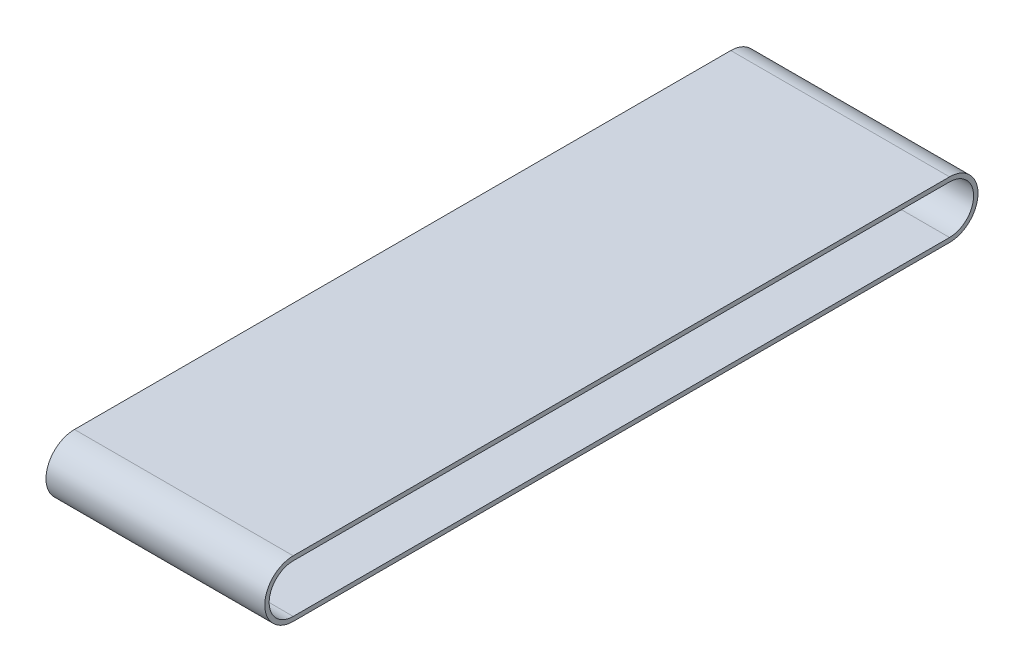
ISO-10303-21;
HEADER;
FILE_DESCRIPTION(('STEP AP214'),'2;1');
FILE_NAME('part.step','',(''),(''),'','','');
FILE_SCHEMA(('AUTOMOTIVE_DESIGN { 1 0 10303 214 1 1 1 1 }'));
ENDSEC;
DATA;
#1=APPLICATION_CONTEXT('core data for automotive mechanical design processes');
#2=APPLICATION_PROTOCOL_DEFINITION('international standard','automotive_design',2000,#1);
#3=PRODUCT_CONTEXT('',#1,'mechanical');
#4=PRODUCT('Part','Part','',(#3));
#5=PRODUCT_RELATED_PRODUCT_CATEGORY('part','',(#4));
#6=PRODUCT_DEFINITION_FORMATION('','',#4);
#7=PRODUCT_DEFINITION_CONTEXT('part definition',#1,'design');
#8=PRODUCT_DEFINITION('design','',#6,#7);
#9=PRODUCT_DEFINITION_SHAPE('','',#8);
#10=(LENGTH_UNIT() NAMED_UNIT(*) SI_UNIT(.MILLI.,.METRE.));
#11=(NAMED_UNIT(*) PLANE_ANGLE_UNIT() SI_UNIT($,.RADIAN.));
#12=(NAMED_UNIT(*) SI_UNIT($,.STERADIAN.) SOLID_ANGLE_UNIT());
#13=UNCERTAINTY_MEASURE_WITH_UNIT(LENGTH_MEASURE(1.E-05),#10,'distance_accuracy_value','');
#14=(GEOMETRIC_REPRESENTATION_CONTEXT(3) GLOBAL_UNCERTAINTY_ASSIGNED_CONTEXT((#13)) GLOBAL_UNIT_ASSIGNED_CONTEXT((#10,
#11,#12)) REPRESENTATION_CONTEXT('',''));
#15=CARTESIAN_POINT('',(0.,0.,0.));
#16=DIRECTION('',(0.,0.,1.));
#17=DIRECTION('',(1.,0.,0.));
#18=AXIS2_PLACEMENT_3D('',#15,#16,#17);
#19=CARTESIAN_POINT('',(100.,22.8481012658228,183.678713125152));
#20=DIRECTION('',(1.,0.,0.));
#21=DIRECTION('',(0.,0.,-1.));
#22=AXIS2_PLACEMENT_3D('',#19,#20,#21);
#23=PLANE('',#22);
#24=CARTESIAN_POINT('',(100.,22.8481012658228,183.678713125152));
#25=DIRECTION('',(1.,0.,0.));
#26=DIRECTION('',(0.,0.,-1.));
#27=AXIS2_PLACEMENT_3D('',#24,#25,#26);
#28=CIRCLE('',#27,13.);
#29=CARTESIAN_POINT('',(100.,35.8481012658228,183.678713125152));
#30=VERTEX_POINT('',#29);
#31=CARTESIAN_POINT('',(100.,9.84810126582282,183.678713125152));
#32=VERTEX_POINT('',#31);
#33=EDGE_CURVE('E134',#30,#32,#28,.T.);
#34=ORIENTED_EDGE('',*,*,#33,.T.);
#35=DIRECTION('',(0.,0.,-1.));
#36=VECTOR('',#35,1.);
#37=CARTESIAN_POINT('',(100.,9.84810126582282,183.678713125152));
#38=LINE('',#37,#36);
#39=CARTESIAN_POINT('',(100.,9.84810126582286,-116.321286874848));
#40=VERTEX_POINT('',#39);
#41=EDGE_CURVE('E137',#32,#40,#38,.T.);
#42=ORIENTED_EDGE('',*,*,#41,.T.);
#43=CARTESIAN_POINT('',(100.,22.8481012658229,-116.321286874848));
#44=DIRECTION('',(1.,0.,0.));
#45=DIRECTION('',(0.,0.,1.));
#46=AXIS2_PLACEMENT_3D('',#43,#44,#45);
#47=CIRCLE('',#46,13.);
#48=CARTESIAN_POINT('',(100.,35.8481012658228,-116.321286874848));
#49=VERTEX_POINT('',#48);
#50=EDGE_CURVE('E140',#40,#49,#47,.T.);
#51=ORIENTED_EDGE('',*,*,#50,.T.);
#52=DIRECTION('',(0.,0.,1.));
#53=VECTOR('',#52,1.);
#54=CARTESIAN_POINT('',(100.,35.8481012658228,183.678713125152));
#55=LINE('',#54,#53);
#56=EDGE_CURVE('E142',#49,#30,#55,.T.);
#57=ORIENTED_EDGE('',*,*,#56,.T.);
#58=EDGE_LOOP('',(#34,#42,#51,#57));
#59=FACE_BOUND('',#58,.T.);
#60=DIRECTION('',(0.,0.,-1.));
#61=VECTOR('',#60,1.);
#62=CARTESIAN_POINT('',(100.,11.8481012658228,183.678713125152));
#63=LINE('',#62,#61);
#64=CARTESIAN_POINT('',(100.,11.8481012658228,183.678713125152));
#65=VERTEX_POINT('',#64);
#66=CARTESIAN_POINT('',(100.,11.8481012658228,-116.321286874848));
#67=VERTEX_POINT('',#66);
#68=EDGE_CURVE('E106',#65,#67,#63,.T.);
#69=ORIENTED_EDGE('',*,*,#68,.F.);
#70=CARTESIAN_POINT('',(100.,22.8481012658228,183.678713125152));
#71=DIRECTION('',(1.,0.,0.));
#72=DIRECTION('',(0.,0.,-1.));
#73=AXIS2_PLACEMENT_3D('',#70,#71,#72);
#74=CIRCLE('',#73,11.);
#75=CARTESIAN_POINT('',(100.,33.8481012658228,183.678713125152));
#76=VERTEX_POINT('',#75);
#77=EDGE_CURVE('E98',#76,#65,#74,.T.);
#78=ORIENTED_EDGE('',*,*,#77,.F.);
#79=DIRECTION('',(0.,0.,1.));
#80=VECTOR('',#79,1.);
#81=CARTESIAN_POINT('',(100.,33.8481012658228,183.678713125152));
#82=LINE('',#81,#80);
#83=CARTESIAN_POINT('',(100.,33.8481012658229,-116.321286874848));
#84=VERTEX_POINT('',#83);
#85=EDGE_CURVE('E120',#84,#76,#82,.T.);
#86=ORIENTED_EDGE('',*,*,#85,.F.);
#87=CARTESIAN_POINT('',(100.,22.8481012658229,-116.321286874848));
#88=DIRECTION('',(1.,0.,0.));
#89=DIRECTION('',(0.,0.,1.));
#90=AXIS2_PLACEMENT_3D('',#87,#88,#89);
#91=CIRCLE('',#90,11.);
#92=EDGE_CURVE('E118',#67,#84,#91,.T.);
#93=ORIENTED_EDGE('',*,*,#92,.F.);
#94=EDGE_LOOP('',(#69,#78,#86,#93));
#95=FACE_BOUND('',#94,.T.);
#96=ADVANCED_FACE('F33',(#59,#95),#23,.T.);
#97=CARTESIAN_POINT('',(0.,22.8481012658228,183.678713125152));
#98=DIRECTION('',(1.,0.,0.));
#99=DIRECTION('',(0.,0.,-1.));
#100=AXIS2_PLACEMENT_3D('',#97,#98,#99);
#101=PLANE('',#100);
#102=CARTESIAN_POINT('',(0.,22.8481012658228,183.678713125152));
#103=DIRECTION('',(1.,0.,0.));
#104=DIRECTION('',(0.,0.,-1.));
#105=AXIS2_PLACEMENT_3D('',#102,#103,#104);
#106=CIRCLE('',#105,13.);
#107=CARTESIAN_POINT('',(0.,35.8481012658228,183.678713125152));
#108=VERTEX_POINT('',#107);
#109=CARTESIAN_POINT('',(0.,9.84810126582282,183.678713125152));
#110=VERTEX_POINT('',#109);
#111=EDGE_CURVE('E114',#108,#110,#106,.T.);
#112=ORIENTED_EDGE('',*,*,#111,.F.);
#113=DIRECTION('',(0.,0.,1.));
#114=VECTOR('',#113,1.);
#115=CARTESIAN_POINT('',(0.,35.8481012658228,183.678713125152));
#116=LINE('',#115,#114);
#117=CARTESIAN_POINT('',(0.,35.8481012658228,-116.321286874848));
#118=VERTEX_POINT('',#117);
#119=EDGE_CURVE('E138',#118,#108,#116,.T.);
#120=ORIENTED_EDGE('',*,*,#119,.F.);
#121=CARTESIAN_POINT('',(0.,22.8481012658229,-116.321286874848));
#122=DIRECTION('',(1.,0.,0.));
#123=DIRECTION('',(0.,0.,1.));
#124=AXIS2_PLACEMENT_3D('',#121,#122,#123);
#125=CIRCLE('',#124,13.);
#126=CARTESIAN_POINT('',(0.,9.84810126582286,-116.321286874848));
#127=VERTEX_POINT('',#126);
#128=EDGE_CURVE('E149',#127,#118,#125,.T.);
#129=ORIENTED_EDGE('',*,*,#128,.F.);
#130=DIRECTION('',(0.,0.,-1.));
#131=VECTOR('',#130,1.);
#132=CARTESIAN_POINT('',(0.,9.84810126582282,183.678713125152));
#133=LINE('',#132,#131);
#134=EDGE_CURVE('E147',#110,#127,#133,.T.);
#135=ORIENTED_EDGE('',*,*,#134,.F.);
#136=EDGE_LOOP('',(#112,#120,#129,#135));
#137=FACE_BOUND('',#136,.T.);
#138=CARTESIAN_POINT('',(0.,22.8481012658228,183.678713125152));
#139=DIRECTION('',(1.,0.,0.));
#140=DIRECTION('',(0.,0.,-1.));
#141=AXIS2_PLACEMENT_3D('',#138,#139,#140);
#142=CIRCLE('',#141,11.);
#143=CARTESIAN_POINT('',(0.,33.8481012658228,183.678713125152));
#144=VERTEX_POINT('',#143);
#145=CARTESIAN_POINT('',(0.,11.8481012658228,183.678713125152));
#146=VERTEX_POINT('',#145);
#147=EDGE_CURVE('E56',#144,#146,#142,.T.);
#148=ORIENTED_EDGE('',*,*,#147,.T.);
#149=DIRECTION('',(0.,0.,-1.));
#150=VECTOR('',#149,1.);
#151=CARTESIAN_POINT('',(0.,11.8481012658228,183.678713125152));
#152=LINE('',#151,#150);
#153=CARTESIAN_POINT('',(0.,11.8481012658228,-116.321286874848));
#154=VERTEX_POINT('',#153);
#155=EDGE_CURVE('E113',#146,#154,#152,.T.);
#156=ORIENTED_EDGE('',*,*,#155,.T.);
#157=CARTESIAN_POINT('',(0.,22.8481012658229,-116.321286874848));
#158=DIRECTION('',(1.,0.,0.));
#159=DIRECTION('',(0.,0.,1.));
#160=AXIS2_PLACEMENT_3D('',#157,#158,#159);
#161=CIRCLE('',#160,11.);
#162=CARTESIAN_POINT('',(0.,33.8481012658229,-116.321286874848));
#163=VERTEX_POINT('',#162);
#164=EDGE_CURVE('E126',#154,#163,#161,.T.);
#165=ORIENTED_EDGE('',*,*,#164,.T.);
#166=DIRECTION('',(0.,0.,1.));
#167=VECTOR('',#166,1.);
#168=CARTESIAN_POINT('',(0.,33.8481012658228,183.678713125152));
#169=LINE('',#168,#167);
#170=EDGE_CURVE('E107',#163,#144,#169,.T.);
#171=ORIENTED_EDGE('',*,*,#170,.T.);
#172=EDGE_LOOP('',(#148,#156,#165,#171));
#173=FACE_BOUND('',#172,.T.);
#174=ADVANCED_FACE('F167',(#137,#173),#101,.F.);
#175=CARTESIAN_POINT('',(100.,22.8481012658228,183.678713125152));
#176=DIRECTION('',(-1.,0.,0.));
#177=DIRECTION('',(0.,0.,1.));
#178=AXIS2_PLACEMENT_3D('',#175,#176,#177);
#179=CYLINDRICAL_SURFACE('',#178,13.);
#180=ORIENTED_EDGE('',*,*,#111,.T.);
#181=DIRECTION('',(-1.,0.,0.));
#182=VECTOR('',#181,1.);
#183=CARTESIAN_POINT('',(100.,9.84810126582282,183.678713125152));
#184=LINE('',#183,#182);
#185=EDGE_CURVE('E11',#32,#110,#184,.T.);
#186=ORIENTED_EDGE('',*,*,#185,.F.);
#187=ORIENTED_EDGE('',*,*,#33,.F.);
#188=DIRECTION('',(-1.,0.,0.));
#189=VECTOR('',#188,1.);
#190=CARTESIAN_POINT('',(100.,35.8481012658228,183.678713125152));
#191=LINE('',#190,#189);
#192=EDGE_CURVE('E144',#30,#108,#191,.T.);
#193=ORIENTED_EDGE('',*,*,#192,.T.);
#194=EDGE_LOOP('',(#180,#186,#187,#193));
#195=FACE_BOUND('',#194,.T.);
#196=ADVANCED_FACE('F35',(#195),#179,.T.);
#197=CARTESIAN_POINT('',(100.,9.84810126582282,183.678713125152));
#198=DIRECTION('',(0.,1.,0.));
#199=DIRECTION('',(0.,0.,1.));
#200=AXIS2_PLACEMENT_3D('',#197,#198,#199);
#201=PLANE('',#200);
#202=ORIENTED_EDGE('',*,*,#134,.T.);
#203=DIRECTION('',(-1.,0.,0.));
#204=VECTOR('',#203,1.);
#205=CARTESIAN_POINT('',(100.,9.84810126582286,-116.321286874848));
#206=LINE('',#205,#204);
#207=EDGE_CURVE('E41',#40,#127,#206,.T.);
#208=ORIENTED_EDGE('',*,*,#207,.F.);
#209=ORIENTED_EDGE('',*,*,#41,.F.);
#210=ORIENTED_EDGE('',*,*,#185,.T.);
#211=EDGE_LOOP('',(#202,#208,#209,#210));
#212=FACE_BOUND('',#211,.T.);
#213=ADVANCED_FACE('F177',(#212),#201,.F.);
#214=CARTESIAN_POINT('',(100.,22.8481012658229,-116.321286874848));
#215=DIRECTION('',(-1.,0.,0.));
#216=DIRECTION('',(0.,0.,1.));
#217=AXIS2_PLACEMENT_3D('',#214,#215,#216);
#218=CYLINDRICAL_SURFACE('',#217,13.);
#219=ORIENTED_EDGE('',*,*,#128,.T.);
#220=DIRECTION('',(-1.,0.,0.));
#221=VECTOR('',#220,1.);
#222=CARTESIAN_POINT('',(100.,35.8481012658228,-116.321286874848));
#223=LINE('',#222,#221);
#224=EDGE_CURVE('E154',#49,#118,#223,.T.);
#225=ORIENTED_EDGE('',*,*,#224,.F.);
#226=ORIENTED_EDGE('',*,*,#50,.F.);
#227=ORIENTED_EDGE('',*,*,#207,.T.);
#228=EDGE_LOOP('',(#219,#225,#226,#227));
#229=FACE_BOUND('',#228,.T.);
#230=ADVANCED_FACE('F161',(#229),#218,.T.);
#231=CARTESIAN_POINT('',(100.,35.8481012658228,183.678713125152));
#232=DIRECTION('',(0.,-1.,0.));
#233=DIRECTION('',(0.,0.,-1.));
#234=AXIS2_PLACEMENT_3D('',#231,#232,#233);
#235=PLANE('',#234);
#236=ORIENTED_EDGE('',*,*,#119,.T.);
#237=ORIENTED_EDGE('',*,*,#192,.F.);
#238=ORIENTED_EDGE('',*,*,#56,.F.);
#239=ORIENTED_EDGE('',*,*,#224,.T.);
#240=EDGE_LOOP('',(#236,#237,#238,#239));
#241=FACE_BOUND('',#240,.T.);
#242=ADVANCED_FACE('F171',(#241),#235,.F.);
#243=CARTESIAN_POINT('',(100.,22.8481012658228,183.678713125152));
#244=DIRECTION('',(-1.,0.,0.));
#245=DIRECTION('',(0.,0.,1.));
#246=AXIS2_PLACEMENT_3D('',#243,#244,#245);
#247=CYLINDRICAL_SURFACE('',#246,11.);
#248=ORIENTED_EDGE('',*,*,#147,.F.);
#249=DIRECTION('',(-1.,0.,0.));
#250=VECTOR('',#249,1.);
#251=CARTESIAN_POINT('',(100.,33.8481012658228,183.678713125152));
#252=LINE('',#251,#250);
#253=EDGE_CURVE('E102',#76,#144,#252,.T.);
#254=ORIENTED_EDGE('',*,*,#253,.F.);
#255=ORIENTED_EDGE('',*,*,#77,.T.);
#256=DIRECTION('',(-1.,0.,0.));
#257=VECTOR('',#256,1.);
#258=CARTESIAN_POINT('',(100.,11.8481012658228,183.678713125152));
#259=LINE('',#258,#257);
#260=EDGE_CURVE('E101',#65,#146,#259,.T.);
#261=ORIENTED_EDGE('',*,*,#260,.T.);
#262=EDGE_LOOP('',(#248,#254,#255,#261));
#263=FACE_BOUND('',#262,.T.);
#264=ADVANCED_FACE('F100',(#263),#247,.F.);
#265=CARTESIAN_POINT('',(100.,11.8481012658228,183.678713125152));
#266=DIRECTION('',(0.,1.,0.));
#267=DIRECTION('',(0.,0.,1.));
#268=AXIS2_PLACEMENT_3D('',#265,#266,#267);
#269=PLANE('',#268);
#270=ORIENTED_EDGE('',*,*,#155,.F.);
#271=ORIENTED_EDGE('',*,*,#260,.F.);
#272=ORIENTED_EDGE('',*,*,#68,.T.);
#273=DIRECTION('',(-1.,0.,0.));
#274=VECTOR('',#273,1.);
#275=CARTESIAN_POINT('',(100.,11.8481012658228,-116.321286874848));
#276=LINE('',#275,#274);
#277=EDGE_CURVE('E115',#67,#154,#276,.T.);
#278=ORIENTED_EDGE('',*,*,#277,.T.);
#279=EDGE_LOOP('',(#270,#271,#272,#278));
#280=FACE_BOUND('',#279,.T.);
#281=ADVANCED_FACE('F110',(#280),#269,.T.);
#282=CARTESIAN_POINT('',(100.,22.8481012658229,-116.321286874848));
#283=DIRECTION('',(-1.,0.,0.));
#284=DIRECTION('',(0.,0.,1.));
#285=AXIS2_PLACEMENT_3D('',#282,#283,#284);
#286=CYLINDRICAL_SURFACE('',#285,11.);
#287=ORIENTED_EDGE('',*,*,#164,.F.);
#288=ORIENTED_EDGE('',*,*,#277,.F.);
#289=ORIENTED_EDGE('',*,*,#92,.T.);
#290=DIRECTION('',(-1.,0.,0.));
#291=VECTOR('',#290,1.);
#292=CARTESIAN_POINT('',(100.,33.8481012658229,-116.321286874848));
#293=LINE('',#292,#291);
#294=EDGE_CURVE('E48',#84,#163,#293,.T.);
#295=ORIENTED_EDGE('',*,*,#294,.T.);
#296=EDGE_LOOP('',(#287,#288,#289,#295));
#297=FACE_BOUND('',#296,.T.);
#298=ADVANCED_FACE('F200',(#297),#286,.F.);
#299=CARTESIAN_POINT('',(100.,33.8481012658228,183.678713125152));
#300=DIRECTION('',(0.,-1.,0.));
#301=DIRECTION('',(0.,0.,-1.));
#302=AXIS2_PLACEMENT_3D('',#299,#300,#301);
#303=PLANE('',#302);
#304=ORIENTED_EDGE('',*,*,#170,.F.);
#305=ORIENTED_EDGE('',*,*,#294,.F.);
#306=ORIENTED_EDGE('',*,*,#85,.T.);
#307=ORIENTED_EDGE('',*,*,#253,.T.);
#308=EDGE_LOOP('',(#304,#305,#306,#307));
#309=FACE_BOUND('',#308,.T.);
#310=ADVANCED_FACE('F204',(#309),#303,.T.);
#311=CLOSED_SHELL('',(#96,#174,#196,#213,#230,#242,#264,#281,#298,#310));
#312=MANIFOLD_SOLID_BREP('B2',#311);
#313=ADVANCED_BREP_SHAPE_REPRESENTATION('',(#18,#312),#14);
#314=SHAPE_DEFINITION_REPRESENTATION(#9,#313);
ENDSEC;
END-ISO-10303-21;
